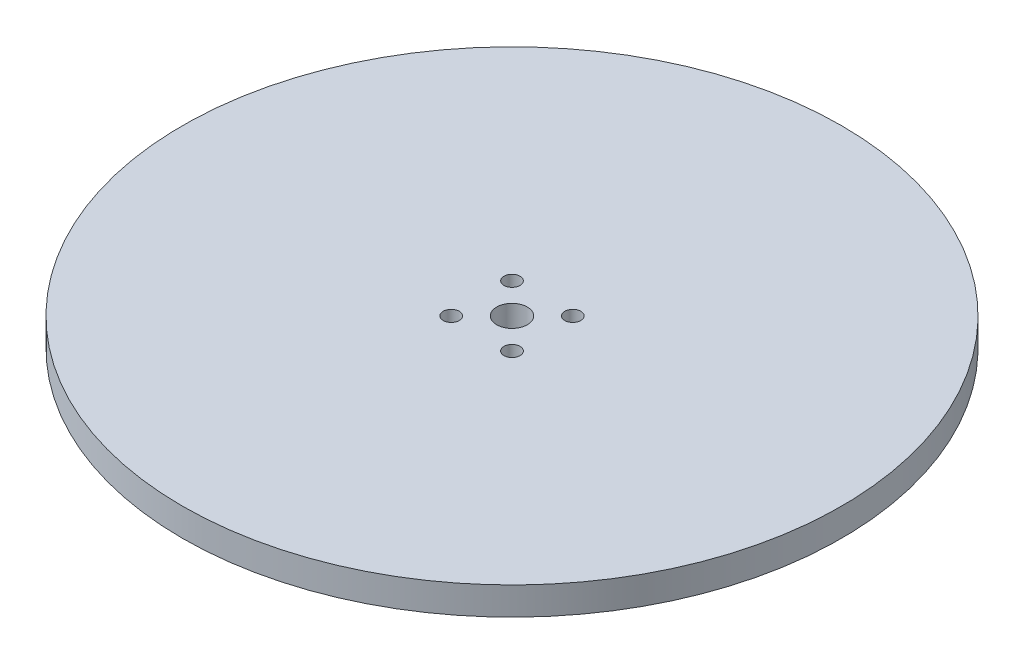
ISO-10303-21;
HEADER;
FILE_DESCRIPTION(('STEP AP214'),'2;1');
FILE_NAME('part.step','',(''),(''),'','','');
FILE_SCHEMA(('AUTOMOTIVE_DESIGN { 1 0 10303 214 1 1 1 1 }'));
ENDSEC;
DATA;
#1=APPLICATION_CONTEXT('core data for automotive mechanical design processes');
#2=APPLICATION_PROTOCOL_DEFINITION('international standard','automotive_design',2000,#1);
#3=PRODUCT_CONTEXT('',#1,'mechanical');
#4=PRODUCT('Part','Part','',(#3));
#5=PRODUCT_RELATED_PRODUCT_CATEGORY('part','',(#4));
#6=PRODUCT_DEFINITION_FORMATION('','',#4);
#7=PRODUCT_DEFINITION_CONTEXT('part definition',#1,'design');
#8=PRODUCT_DEFINITION('design','',#6,#7);
#9=PRODUCT_DEFINITION_SHAPE('','',#8);
#10=(LENGTH_UNIT() NAMED_UNIT(*) SI_UNIT(.MILLI.,.METRE.));
#11=(NAMED_UNIT(*) PLANE_ANGLE_UNIT() SI_UNIT($,.RADIAN.));
#12=(NAMED_UNIT(*) SI_UNIT($,.STERADIAN.) SOLID_ANGLE_UNIT());
#13=UNCERTAINTY_MEASURE_WITH_UNIT(LENGTH_MEASURE(1.E-05),#10,'distance_accuracy_value','');
#14=(GEOMETRIC_REPRESENTATION_CONTEXT(3) GLOBAL_UNCERTAINTY_ASSIGNED_CONTEXT((#13)) GLOBAL_UNIT_ASSIGNED_CONTEXT((#10,
#11,#12)) REPRESENTATION_CONTEXT('',''));
#15=CARTESIAN_POINT('',(0.,0.,0.));
#16=DIRECTION('',(0.,0.,1.));
#17=DIRECTION('',(1.,0.,0.));
#18=AXIS2_PLACEMENT_3D('',#15,#16,#17);
#19=CARTESIAN_POINT('',(0.,6.35,0.));
#20=DIRECTION('',(0.,-1.,0.));
#21=DIRECTION('',(0.,0.,-1.));
#22=AXIS2_PLACEMENT_3D('',#19,#20,#21);
#23=CYLINDRICAL_SURFACE('',#22,75.);
#24=CARTESIAN_POINT('',(0.,6.35,0.));
#25=DIRECTION('',(0.,1.,0.));
#26=DIRECTION('',(0.,0.,1.));
#27=AXIS2_PLACEMENT_3D('',#24,#25,#26);
#28=CIRCLE('',#27,75.);
#29=CARTESIAN_POINT('',(0.,6.35,75.));
#30=VERTEX_POINT('',#29);
#31=EDGE_CURVE('E10',#30,#30,#28,.T.);
#32=ORIENTED_EDGE('',*,*,#31,.F.);
#33=EDGE_LOOP('',(#32));
#34=FACE_BOUND('',#33,.T.);
#35=CARTESIAN_POINT('',(0.,0.,0.));
#36=DIRECTION('',(0.,1.,0.));
#37=DIRECTION('',(0.,0.,1.));
#38=AXIS2_PLACEMENT_3D('',#35,#36,#37);
#39=CIRCLE('',#38,75.);
#40=CARTESIAN_POINT('',(0.,0.,75.));
#41=VERTEX_POINT('',#40);
#42=EDGE_CURVE('E39',#41,#41,#39,.T.);
#43=ORIENTED_EDGE('',*,*,#42,.T.);
#44=EDGE_LOOP('',(#43));
#45=FACE_BOUND('',#44,.T.);
#46=ADVANCED_FACE('F36',(#34,#45),#23,.T.);
#47=CARTESIAN_POINT('',(0.,6.35,0.));
#48=DIRECTION('',(0.,1.,0.));
#49=DIRECTION('',(0.,0.,1.));
#50=AXIS2_PLACEMENT_3D('',#47,#48,#49);
#51=PLANE('',#50);
#52=CARTESIAN_POINT('',(6.91479721322326,6.35,6.91479721322308));
#53=DIRECTION('',(0.,1.,0.));
#54=DIRECTION('',(0.,0.,1.));
#55=AXIS2_PLACEMENT_3D('',#52,#53,#54);
#56=CIRCLE('',#55,1.8288);
#57=CARTESIAN_POINT('',(6.91479721322326,6.35,8.74359721322308));
#58=VERTEX_POINT('',#57);
#59=EDGE_CURVE('E59',#58,#58,#56,.F.);
#60=ORIENTED_EDGE('',*,*,#59,.T.);
#61=EDGE_LOOP('',(#60));
#62=FACE_BOUND('',#61,.T.);
#63=CARTESIAN_POINT('',(6.9147972132231,6.35,-6.91479721322324));
#64=DIRECTION('',(0.,1.,0.));
#65=DIRECTION('',(0.,0.,1.));
#66=AXIS2_PLACEMENT_3D('',#63,#64,#65);
#67=CIRCLE('',#66,1.8288);
#68=CARTESIAN_POINT('',(6.9147972132231,6.35,-5.08599721322324));
#69=VERTEX_POINT('',#68);
#70=EDGE_CURVE('E67',#69,#69,#67,.F.);
#71=ORIENTED_EDGE('',*,*,#70,.T.);
#72=EDGE_LOOP('',(#71));
#73=FACE_BOUND('',#72,.T.);
#74=CARTESIAN_POINT('',(-6.91479721322331,6.35,-6.91479721322303));
#75=DIRECTION('',(0.,1.,0.));
#76=DIRECTION('',(0.,0.,1.));
#77=AXIS2_PLACEMENT_3D('',#74,#75,#76);
#78=CIRCLE('',#77,1.8288);
#79=CARTESIAN_POINT('',(-6.91479721322331,6.35,-5.08599721322303));
#80=VERTEX_POINT('',#79);
#81=EDGE_CURVE('E60',#80,#80,#78,.F.);
#82=ORIENTED_EDGE('',*,*,#81,.T.);
#83=EDGE_LOOP('',(#82));
#84=FACE_BOUND('',#83,.T.);
#85=CARTESIAN_POINT('',(-6.9147972132231,6.35,6.91479721322324));
#86=DIRECTION('',(0.,1.,0.));
#87=DIRECTION('',(0.,0.,1.));
#88=AXIS2_PLACEMENT_3D('',#85,#86,#87);
#89=CIRCLE('',#88,1.8288);
#90=CARTESIAN_POINT('',(-6.9147972132231,6.35,8.74359721322324));
#91=VERTEX_POINT('',#90);
#92=EDGE_CURVE('E53',#91,#91,#89,.F.);
#93=ORIENTED_EDGE('',*,*,#92,.T.);
#94=EDGE_LOOP('',(#93));
#95=FACE_BOUND('',#94,.T.);
#96=CARTESIAN_POINT('',(0.,6.35,0.));
#97=DIRECTION('',(0.,1.,0.));
#98=DIRECTION('',(0.,0.,1.));
#99=AXIS2_PLACEMENT_3D('',#96,#97,#98);
#100=CIRCLE('',#99,3.5);
#101=CARTESIAN_POINT('',(0.,6.35,3.5));
#102=VERTEX_POINT('',#101);
#103=EDGE_CURVE('E50',#102,#102,#100,.T.);
#104=ORIENTED_EDGE('',*,*,#103,.F.);
#105=EDGE_LOOP('',(#104));
#106=FACE_BOUND('',#105,.T.);
#107=ORIENTED_EDGE('',*,*,#31,.T.);
#108=EDGE_LOOP('',(#107));
#109=FACE_BOUND('',#108,.T.);
#110=ADVANCED_FACE('F85',(#62,#73,#84,#95,#106,#109),#51,.T.);
#111=CARTESIAN_POINT('',(0.,0.,0.));
#112=DIRECTION('',(0.,1.,0.));
#113=DIRECTION('',(0.,0.,1.));
#114=AXIS2_PLACEMENT_3D('',#111,#112,#113);
#115=PLANE('',#114);
#116=CARTESIAN_POINT('',(6.91479721322326,0.,6.91479721322308));
#117=DIRECTION('',(0.,-1.,0.));
#118=DIRECTION('',(-1.,0.,0.));
#119=AXIS2_PLACEMENT_3D('',#116,#117,#118);
#120=CIRCLE('',#119,1.8288);
#121=CARTESIAN_POINT('',(5.08599721322326,0.,6.91479721322308));
#122=VERTEX_POINT('',#121);
#123=EDGE_CURVE('E70',#122,#122,#120,.T.);
#124=ORIENTED_EDGE('',*,*,#123,.F.);
#125=EDGE_LOOP('',(#124));
#126=FACE_BOUND('',#125,.T.);
#127=CARTESIAN_POINT('',(6.9147972132231,0.,-6.91479721322324));
#128=DIRECTION('',(0.,-1.,0.));
#129=DIRECTION('',(0.,0.,1.));
#130=AXIS2_PLACEMENT_3D('',#127,#128,#129);
#131=CIRCLE('',#130,1.8288);
#132=CARTESIAN_POINT('',(6.9147972132231,0.,-5.08599721322324));
#133=VERTEX_POINT('',#132);
#134=EDGE_CURVE('E63',#133,#133,#131,.T.);
#135=ORIENTED_EDGE('',*,*,#134,.F.);
#136=EDGE_LOOP('',(#135));
#137=FACE_BOUND('',#136,.T.);
#138=CARTESIAN_POINT('',(-6.91479721322331,0.,-6.91479721322303));
#139=DIRECTION('',(0.,-1.,0.));
#140=DIRECTION('',(1.,0.,0.));
#141=AXIS2_PLACEMENT_3D('',#138,#139,#140);
#142=CIRCLE('',#141,1.8288);
#143=CARTESIAN_POINT('',(-5.08599721322331,0.,-6.91479721322305));
#144=VERTEX_POINT('',#143);
#145=EDGE_CURVE('E64',#144,#144,#142,.T.);
#146=ORIENTED_EDGE('',*,*,#145,.F.);
#147=EDGE_LOOP('',(#146));
#148=FACE_BOUND('',#147,.T.);
#149=CARTESIAN_POINT('',(-6.9147972132231,0.,6.91479721322324));
#150=DIRECTION('',(0.,-1.,0.));
#151=DIRECTION('',(0.,0.,-1.));
#152=AXIS2_PLACEMENT_3D('',#149,#150,#151);
#153=CIRCLE('',#152,1.8288);
#154=CARTESIAN_POINT('',(-6.9147972132231,0.,5.08599721322324));
#155=VERTEX_POINT('',#154);
#156=EDGE_CURVE('E56',#155,#155,#153,.T.);
#157=ORIENTED_EDGE('',*,*,#156,.F.);
#158=EDGE_LOOP('',(#157));
#159=FACE_BOUND('',#158,.T.);
#160=CARTESIAN_POINT('',(0.,0.,0.));
#161=DIRECTION('',(0.,1.,0.));
#162=DIRECTION('',(0.,0.,1.));
#163=AXIS2_PLACEMENT_3D('',#160,#161,#162);
#164=CIRCLE('',#163,3.5);
#165=CARTESIAN_POINT('',(0.,0.,3.5));
#166=VERTEX_POINT('',#165);
#167=EDGE_CURVE('E46',#166,#166,#164,.F.);
#168=ORIENTED_EDGE('',*,*,#167,.F.);
#169=EDGE_LOOP('',(#168));
#170=FACE_BOUND('',#169,.T.);
#171=ORIENTED_EDGE('',*,*,#42,.F.);
#172=EDGE_LOOP('',(#171));
#173=FACE_BOUND('',#172,.T.);
#174=ADVANCED_FACE('F81',(#126,#137,#148,#159,#170,#173),#115,.F.);
#175=CARTESIAN_POINT('',(0.,-9.89949493661167,0.));
#176=DIRECTION('',(0.,1.,0.));
#177=DIRECTION('',(0.,0.,1.));
#178=AXIS2_PLACEMENT_3D('',#175,#176,#177);
#179=CYLINDRICAL_SURFACE('',#178,3.5);
#180=ORIENTED_EDGE('',*,*,#167,.T.);
#181=EDGE_LOOP('',(#180));
#182=FACE_BOUND('',#181,.T.);
#183=ORIENTED_EDGE('',*,*,#103,.T.);
#184=EDGE_LOOP('',(#183));
#185=FACE_BOUND('',#184,.T.);
#186=ADVANCED_FACE('F84',(#182,#185),#179,.F.);
#187=CARTESIAN_POINT('',(-6.9147972132231,11.5226275257358,6.91479721322324));
#188=DIRECTION('',(0.,-1.,0.));
#189=DIRECTION('',(0.,0.,-1.));
#190=AXIS2_PLACEMENT_3D('',#187,#188,#189);
#191=CYLINDRICAL_SURFACE('',#190,1.8288);
#192=ORIENTED_EDGE('',*,*,#156,.T.);
#193=EDGE_LOOP('',(#192));
#194=FACE_BOUND('',#193,.T.);
#195=ORIENTED_EDGE('',*,*,#92,.F.);
#196=EDGE_LOOP('',(#195));
#197=FACE_BOUND('',#196,.T.);
#198=ADVANCED_FACE('F110',(#194,#197),#191,.F.);
#199=CARTESIAN_POINT('',(-6.91479721322331,11.5226275257358,-6.91479721322303));
#200=DIRECTION('',(0.,-1.,0.));
#201=DIRECTION('',(0.,0.,-1.));
#202=AXIS2_PLACEMENT_3D('',#199,#200,#201);
#203=CYLINDRICAL_SURFACE('',#202,1.8288);
#204=ORIENTED_EDGE('',*,*,#145,.T.);
#205=EDGE_LOOP('',(#204));
#206=FACE_BOUND('',#205,.T.);
#207=ORIENTED_EDGE('',*,*,#81,.F.);
#208=EDGE_LOOP('',(#207));
#209=FACE_BOUND('',#208,.T.);
#210=ADVANCED_FACE('F114',(#206,#209),#203,.F.);
#211=CARTESIAN_POINT('',(6.9147972132231,11.5226275257358,-6.91479721322324));
#212=DIRECTION('',(0.,-1.,0.));
#213=DIRECTION('',(0.,0.,-1.));
#214=AXIS2_PLACEMENT_3D('',#211,#212,#213);
#215=CYLINDRICAL_SURFACE('',#214,1.8288);
#216=ORIENTED_EDGE('',*,*,#134,.T.);
#217=EDGE_LOOP('',(#216));
#218=FACE_BOUND('',#217,.T.);
#219=ORIENTED_EDGE('',*,*,#70,.F.);
#220=EDGE_LOOP('',(#219));
#221=FACE_BOUND('',#220,.T.);
#222=ADVANCED_FACE('F118',(#218,#221),#215,.F.);
#223=CARTESIAN_POINT('',(6.91479721322326,11.5226275257358,6.91479721322308));
#224=DIRECTION('',(0.,-1.,0.));
#225=DIRECTION('',(1.,0.,0.));
#226=AXIS2_PLACEMENT_3D('',#223,#224,#225);
#227=CYLINDRICAL_SURFACE('',#226,1.8288);
#228=ORIENTED_EDGE('',*,*,#123,.T.);
#229=EDGE_LOOP('',(#228));
#230=FACE_BOUND('',#229,.T.);
#231=ORIENTED_EDGE('',*,*,#59,.F.);
#232=EDGE_LOOP('',(#231));
#233=FACE_BOUND('',#232,.T.);
#234=ADVANCED_FACE('F78',(#230,#233),#227,.F.);
#235=CLOSED_SHELL('',(#46,#110,#174,#186,#198,#210,#222,#234));
#236=MANIFOLD_SOLID_BREP('B2',#235);
#237=ADVANCED_BREP_SHAPE_REPRESENTATION('',(#18,#236),#14);
#238=SHAPE_DEFINITION_REPRESENTATION(#9,#237);
ENDSEC;
END-ISO-10303-21;
